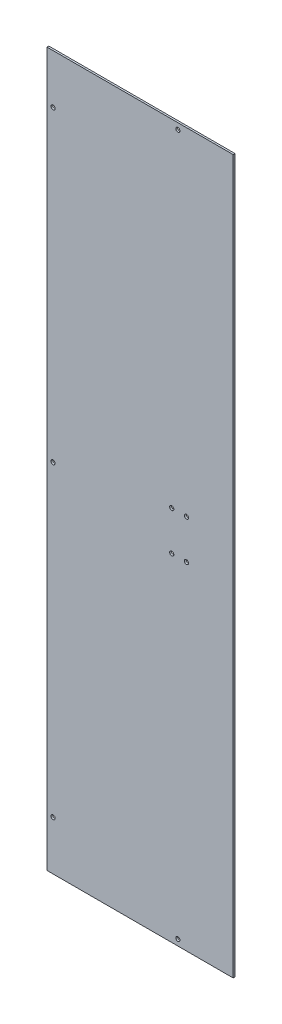
ISO-10303-21;
HEADER;
FILE_DESCRIPTION(('STEP AP214'),'2;1');
FILE_NAME('part.step','',(''),(''),'','','');
FILE_SCHEMA(('AUTOMOTIVE_DESIGN { 1 0 10303 214 1 1 1 1 }'));
ENDSEC;
DATA;
#1=APPLICATION_CONTEXT('core data for automotive mechanical design processes');
#2=APPLICATION_PROTOCOL_DEFINITION('international standard','automotive_design',2000,#1);
#3=PRODUCT_CONTEXT('',#1,'mechanical');
#4=PRODUCT('Part','Part','',(#3));
#5=PRODUCT_RELATED_PRODUCT_CATEGORY('part','',(#4));
#6=PRODUCT_DEFINITION_FORMATION('','',#4);
#7=PRODUCT_DEFINITION_CONTEXT('part definition',#1,'design');
#8=PRODUCT_DEFINITION('design','',#6,#7);
#9=PRODUCT_DEFINITION_SHAPE('','',#8);
#10=(LENGTH_UNIT() NAMED_UNIT(*) SI_UNIT(.MILLI.,.METRE.));
#11=(NAMED_UNIT(*) PLANE_ANGLE_UNIT() SI_UNIT($,.RADIAN.));
#12=(NAMED_UNIT(*) SI_UNIT($,.STERADIAN.) SOLID_ANGLE_UNIT());
#13=UNCERTAINTY_MEASURE_WITH_UNIT(LENGTH_MEASURE(1.E-05),#10,'distance_accuracy_value','');
#14=(GEOMETRIC_REPRESENTATION_CONTEXT(3) GLOBAL_UNCERTAINTY_ASSIGNED_CONTEXT((#13)) GLOBAL_UNIT_ASSIGNED_CONTEXT((#10,
#11,#12)) REPRESENTATION_CONTEXT('',''));
#15=CARTESIAN_POINT('',(0.,0.,0.));
#16=DIRECTION('',(0.,0.,1.));
#17=DIRECTION('',(1.,0.,0.));
#18=AXIS2_PLACEMENT_3D('',#15,#16,#17);
#19=CARTESIAN_POINT('',(83.5,290.,110.));
#20=DIRECTION('',(-1.,0.,0.));
#21=DIRECTION('',(0.,0.,1.));
#22=AXIS2_PLACEMENT_3D('',#19,#20,#21);
#23=PLANE('',#22);
#24=DIRECTION('',(0.,-1.,0.));
#25=VECTOR('',#24,1.);
#26=CARTESIAN_POINT('',(83.5,290.,111.5));
#27=LINE('',#26,#25);
#28=CARTESIAN_POINT('',(83.5,290.,111.5));
#29=VERTEX_POINT('',#28);
#30=CARTESIAN_POINT('',(83.5,-290.,111.5));
#31=VERTEX_POINT('',#30);
#32=EDGE_CURVE('E106',#29,#31,#27,.T.);
#33=ORIENTED_EDGE('',*,*,#32,.F.);
#34=DIRECTION('',(0.,0.,1.));
#35=VECTOR('',#34,1.);
#36=CARTESIAN_POINT('',(83.5,290.,110.));
#37=LINE('',#36,#35);
#38=CARTESIAN_POINT('',(83.5,290.,110.));
#39=VERTEX_POINT('',#38);
#40=EDGE_CURVE('E11',#39,#29,#37,.T.);
#41=ORIENTED_EDGE('',*,*,#40,.F.);
#42=DIRECTION('',(0.,-1.,0.));
#43=VECTOR('',#42,1.);
#44=CARTESIAN_POINT('',(83.5,290.,110.));
#45=LINE('',#44,#43);
#46=CARTESIAN_POINT('',(83.5,-290.,110.));
#47=VERTEX_POINT('',#46);
#48=EDGE_CURVE('E97',#39,#47,#45,.T.);
#49=ORIENTED_EDGE('',*,*,#48,.T.);
#50=DIRECTION('',(0.,0.,1.));
#51=VECTOR('',#50,1.);
#52=CARTESIAN_POINT('',(83.5,-290.,110.));
#53=LINE('',#52,#51);
#54=EDGE_CURVE('E42',#47,#31,#53,.T.);
#55=ORIENTED_EDGE('',*,*,#54,.T.);
#56=EDGE_LOOP('',(#33,#41,#49,#55));
#57=FACE_BOUND('',#56,.T.);
#58=ADVANCED_FACE('F41',(#57),#23,.T.);
#59=CARTESIAN_POINT('',(83.5,290.,110.));
#60=DIRECTION('',(0.,1.,0.));
#61=DIRECTION('',(0.,0.,1.));
#62=AXIS2_PLACEMENT_3D('',#59,#60,#61);
#63=PLANE('',#62);
#64=DIRECTION('',(-1.,0.,0.));
#65=VECTOR('',#64,1.);
#66=CARTESIAN_POINT('',(83.5,290.,111.5));
#67=LINE('',#66,#65);
#68=CARTESIAN_POINT('',(235.,290.,111.5));
#69=VERTEX_POINT('',#68);
#70=EDGE_CURVE('E101',#69,#29,#67,.T.);
#71=ORIENTED_EDGE('',*,*,#70,.F.);
#72=DIRECTION('',(0.,0.,1.));
#73=VECTOR('',#72,1.);
#74=CARTESIAN_POINT('',(235.,290.,110.));
#75=LINE('',#74,#73);
#76=CARTESIAN_POINT('',(235.,290.,110.));
#77=VERTEX_POINT('',#76);
#78=EDGE_CURVE('E49',#77,#69,#75,.T.);
#79=ORIENTED_EDGE('',*,*,#78,.F.);
#80=DIRECTION('',(-1.,0.,0.));
#81=VECTOR('',#80,1.);
#82=CARTESIAN_POINT('',(83.5,290.,110.));
#83=LINE('',#82,#81);
#84=EDGE_CURVE('E96',#77,#39,#83,.T.);
#85=ORIENTED_EDGE('',*,*,#84,.T.);
#86=ORIENTED_EDGE('',*,*,#40,.T.);
#87=EDGE_LOOP('',(#71,#79,#85,#86));
#88=FACE_BOUND('',#87,.T.);
#89=ADVANCED_FACE('F120',(#88),#63,.T.);
#90=CARTESIAN_POINT('',(235.,290.,110.));
#91=DIRECTION('',(1.,0.,0.));
#92=DIRECTION('',(0.,0.,-1.));
#93=AXIS2_PLACEMENT_3D('',#90,#91,#92);
#94=PLANE('',#93);
#95=DIRECTION('',(0.,1.,0.));
#96=VECTOR('',#95,1.);
#97=CARTESIAN_POINT('',(235.,290.,111.5));
#98=LINE('',#97,#96);
#99=CARTESIAN_POINT('',(235.,-290.,111.5));
#100=VERTEX_POINT('',#99);
#101=EDGE_CURVE('E93',#100,#69,#98,.T.);
#102=ORIENTED_EDGE('',*,*,#101,.F.);
#103=DIRECTION('',(0.,0.,1.));
#104=VECTOR('',#103,1.);
#105=CARTESIAN_POINT('',(235.,-290.,110.));
#106=LINE('',#105,#104);
#107=CARTESIAN_POINT('',(235.,-290.,110.));
#108=VERTEX_POINT('',#107);
#109=EDGE_CURVE('E88',#108,#100,#106,.T.);
#110=ORIENTED_EDGE('',*,*,#109,.F.);
#111=DIRECTION('',(0.,1.,0.));
#112=VECTOR('',#111,1.);
#113=CARTESIAN_POINT('',(235.,290.,110.));
#114=LINE('',#113,#112);
#115=EDGE_CURVE('E90',#108,#77,#114,.T.);
#116=ORIENTED_EDGE('',*,*,#115,.T.);
#117=ORIENTED_EDGE('',*,*,#78,.T.);
#118=EDGE_LOOP('',(#102,#110,#116,#117));
#119=FACE_BOUND('',#118,.T.);
#120=ADVANCED_FACE('F86',(#119),#94,.T.);
#121=CARTESIAN_POINT('',(83.5,-290.,110.));
#122=DIRECTION('',(0.,-1.,0.));
#123=DIRECTION('',(0.,0.,-1.));
#124=AXIS2_PLACEMENT_3D('',#121,#122,#123);
#125=PLANE('',#124);
#126=DIRECTION('',(1.,0.,0.));
#127=VECTOR('',#126,1.);
#128=CARTESIAN_POINT('',(83.5,-290.,111.5));
#129=LINE('',#128,#127);
#130=EDGE_CURVE('E108',#31,#100,#129,.T.);
#131=ORIENTED_EDGE('',*,*,#130,.F.);
#132=ORIENTED_EDGE('',*,*,#54,.F.);
#133=DIRECTION('',(1.,0.,0.));
#134=VECTOR('',#133,1.);
#135=CARTESIAN_POINT('',(83.5,-290.,110.));
#136=LINE('',#135,#134);
#137=EDGE_CURVE('E92',#47,#108,#136,.T.);
#138=ORIENTED_EDGE('',*,*,#137,.T.);
#139=ORIENTED_EDGE('',*,*,#109,.T.);
#140=EDGE_LOOP('',(#131,#132,#138,#139));
#141=FACE_BOUND('',#140,.T.);
#142=ADVANCED_FACE('F98',(#141),#125,.T.);
#143=CARTESIAN_POINT('',(0.,0.,110.));
#144=DIRECTION('',(0.,0.,1.));
#145=DIRECTION('',(1.,0.,0.));
#146=AXIS2_PLACEMENT_3D('',#143,#144,#145);
#147=PLANE('',#146);
#148=CARTESIAN_POINT('',(190.,285.,110.));
#149=DIRECTION('',(0.,0.,1.));
#150=DIRECTION('',(1.,0.,0.));
#151=AXIS2_PLACEMENT_3D('',#148,#149,#150);
#152=CIRCLE('',#151,1.70000000000001);
#153=CARTESIAN_POINT('',(191.7,285.,110.));
#154=VERTEX_POINT('',#153);
#155=EDGE_CURVE('E179',#154,#154,#152,.T.);
#156=ORIENTED_EDGE('',*,*,#155,.T.);
#157=EDGE_LOOP('',(#156));
#158=FACE_BOUND('',#157,.T.);
#159=CARTESIAN_POINT('',(197.,16.,110.));
#160=DIRECTION('',(0.,0.,1.));
#161=DIRECTION('',(1.,0.,0.));
#162=AXIS2_PLACEMENT_3D('',#159,#160,#161);
#163=CIRCLE('',#162,1.70000000000001);
#164=CARTESIAN_POINT('',(198.7,16.,110.));
#165=VERTEX_POINT('',#164);
#166=EDGE_CURVE('E187',#165,#165,#163,.T.);
#167=ORIENTED_EDGE('',*,*,#166,.T.);
#168=EDGE_LOOP('',(#167));
#169=FACE_BOUND('',#168,.T.);
#170=CARTESIAN_POINT('',(185.,16.,110.));
#171=DIRECTION('',(0.,0.,1.));
#172=DIRECTION('',(1.,0.,0.));
#173=AXIS2_PLACEMENT_3D('',#170,#171,#172);
#174=CIRCLE('',#173,1.70000000000001);
#175=CARTESIAN_POINT('',(186.7,16.,110.));
#176=VERTEX_POINT('',#175);
#177=EDGE_CURVE('E195',#176,#176,#174,.T.);
#178=ORIENTED_EDGE('',*,*,#177,.T.);
#179=EDGE_LOOP('',(#178));
#180=FACE_BOUND('',#179,.T.);
#181=CARTESIAN_POINT('',(88.5,250.,110.));
#182=DIRECTION('',(0.,0.,1.));
#183=DIRECTION('',(1.,0.,0.));
#184=AXIS2_PLACEMENT_3D('',#181,#182,#183);
#185=CIRCLE('',#184,1.69999999999999);
#186=CARTESIAN_POINT('',(90.2,250.,110.));
#187=VERTEX_POINT('',#186);
#188=EDGE_CURVE('E196',#187,#187,#185,.T.);
#189=ORIENTED_EDGE('',*,*,#188,.T.);
#190=EDGE_LOOP('',(#189));
#191=FACE_BOUND('',#190,.T.);
#192=CARTESIAN_POINT('',(88.5,0.,110.));
#193=DIRECTION('',(0.,0.,1.));
#194=DIRECTION('',(1.,0.,0.));
#195=AXIS2_PLACEMENT_3D('',#192,#193,#194);
#196=CIRCLE('',#195,1.69999999999999);
#197=CARTESIAN_POINT('',(90.2,0.,110.));
#198=VERTEX_POINT('',#197);
#199=EDGE_CURVE('E204',#198,#198,#196,.T.);
#200=ORIENTED_EDGE('',*,*,#199,.T.);
#201=EDGE_LOOP('',(#200));
#202=FACE_BOUND('',#201,.T.);
#203=CARTESIAN_POINT('',(197.,-16.,110.));
#204=DIRECTION('',(0.,0.,1.));
#205=DIRECTION('',(1.,0.,0.));
#206=AXIS2_PLACEMENT_3D('',#203,#204,#205);
#207=CIRCLE('',#206,1.70000000000001);
#208=CARTESIAN_POINT('',(198.7,-16.,110.));
#209=VERTEX_POINT('',#208);
#210=EDGE_CURVE('E209',#209,#209,#207,.T.);
#211=ORIENTED_EDGE('',*,*,#210,.T.);
#212=EDGE_LOOP('',(#211));
#213=FACE_BOUND('',#212,.T.);
#214=CARTESIAN_POINT('',(185.,-16.,110.));
#215=DIRECTION('',(0.,0.,1.));
#216=DIRECTION('',(1.,0.,0.));
#217=AXIS2_PLACEMENT_3D('',#214,#215,#216);
#218=CIRCLE('',#217,1.70000000000001);
#219=CARTESIAN_POINT('',(186.7,-16.,110.));
#220=VERTEX_POINT('',#219);
#221=EDGE_CURVE('E216',#220,#220,#218,.T.);
#222=ORIENTED_EDGE('',*,*,#221,.T.);
#223=EDGE_LOOP('',(#222));
#224=FACE_BOUND('',#223,.T.);
#225=CARTESIAN_POINT('',(190.,-285.,110.));
#226=DIRECTION('',(0.,0.,1.));
#227=DIRECTION('',(1.,0.,0.));
#228=AXIS2_PLACEMENT_3D('',#225,#226,#227);
#229=CIRCLE('',#228,1.70000000000001);
#230=CARTESIAN_POINT('',(191.7,-285.,110.));
#231=VERTEX_POINT('',#230);
#232=EDGE_CURVE('E225',#231,#231,#229,.T.);
#233=ORIENTED_EDGE('',*,*,#232,.T.);
#234=EDGE_LOOP('',(#233));
#235=FACE_BOUND('',#234,.T.);
#236=CARTESIAN_POINT('',(88.5,-250.,110.));
#237=DIRECTION('',(0.,0.,1.));
#238=DIRECTION('',(1.,0.,0.));
#239=AXIS2_PLACEMENT_3D('',#236,#237,#238);
#240=CIRCLE('',#239,1.69999999999999);
#241=CARTESIAN_POINT('',(90.2,-250.,110.));
#242=VERTEX_POINT('',#241);
#243=EDGE_CURVE('E109',#242,#242,#240,.T.);
#244=ORIENTED_EDGE('',*,*,#243,.T.);
#245=EDGE_LOOP('',(#244));
#246=FACE_BOUND('',#245,.T.);
#247=ORIENTED_EDGE('',*,*,#48,.F.);
#248=ORIENTED_EDGE('',*,*,#84,.F.);
#249=ORIENTED_EDGE('',*,*,#115,.F.);
#250=ORIENTED_EDGE('',*,*,#137,.F.);
#251=EDGE_LOOP('',(#247,#248,#249,#250));
#252=FACE_BOUND('',#251,.T.);
#253=ADVANCED_FACE('F94',(#158,#169,#180,#191,#202,#213,#224,#235,#246,#252),#147,.F.);
#254=CARTESIAN_POINT('',(0.,0.,111.5));
#255=DIRECTION('',(0.,0.,1.));
#256=DIRECTION('',(1.,0.,0.));
#257=AXIS2_PLACEMENT_3D('',#254,#255,#256);
#258=PLANE('',#257);
#259=CARTESIAN_POINT('',(190.,285.,111.5));
#260=DIRECTION('',(0.,0.,1.));
#261=DIRECTION('',(1.,0.,0.));
#262=AXIS2_PLACEMENT_3D('',#259,#260,#261);
#263=CIRCLE('',#262,1.70000000000001);
#264=CARTESIAN_POINT('',(191.7,285.,111.5));
#265=VERTEX_POINT('',#264);
#266=EDGE_CURVE('E182',#265,#265,#263,.T.);
#267=ORIENTED_EDGE('',*,*,#266,.F.);
#268=EDGE_LOOP('',(#267));
#269=FACE_BOUND('',#268,.T.);
#270=CARTESIAN_POINT('',(197.,16.,111.5));
#271=DIRECTION('',(0.,0.,1.));
#272=DIRECTION('',(1.,0.,0.));
#273=AXIS2_PLACEMENT_3D('',#270,#271,#272);
#274=CIRCLE('',#273,1.70000000000001);
#275=CARTESIAN_POINT('',(198.7,16.,111.5));
#276=VERTEX_POINT('',#275);
#277=EDGE_CURVE('E181',#276,#276,#274,.T.);
#278=ORIENTED_EDGE('',*,*,#277,.F.);
#279=EDGE_LOOP('',(#278));
#280=FACE_BOUND('',#279,.T.);
#281=CARTESIAN_POINT('',(185.,16.,111.5));
#282=DIRECTION('',(0.,0.,1.));
#283=DIRECTION('',(1.,0.,0.));
#284=AXIS2_PLACEMENT_3D('',#281,#282,#283);
#285=CIRCLE('',#284,1.70000000000001);
#286=CARTESIAN_POINT('',(186.7,16.,111.5));
#287=VERTEX_POINT('',#286);
#288=EDGE_CURVE('E186',#287,#287,#285,.T.);
#289=ORIENTED_EDGE('',*,*,#288,.F.);
#290=EDGE_LOOP('',(#289));
#291=FACE_BOUND('',#290,.T.);
#292=CARTESIAN_POINT('',(88.5,250.,111.5));
#293=DIRECTION('',(0.,0.,1.));
#294=DIRECTION('',(1.,0.,0.));
#295=AXIS2_PLACEMENT_3D('',#292,#293,#294);
#296=CIRCLE('',#295,1.69999999999999);
#297=CARTESIAN_POINT('',(90.2,250.,111.5));
#298=VERTEX_POINT('',#297);
#299=EDGE_CURVE('E193',#298,#298,#296,.T.);
#300=ORIENTED_EDGE('',*,*,#299,.F.);
#301=EDGE_LOOP('',(#300));
#302=FACE_BOUND('',#301,.T.);
#303=CARTESIAN_POINT('',(88.5,0.,111.5));
#304=DIRECTION('',(0.,0.,1.));
#305=DIRECTION('',(1.,0.,0.));
#306=AXIS2_PLACEMENT_3D('',#303,#304,#305);
#307=CIRCLE('',#306,1.69999999999999);
#308=CARTESIAN_POINT('',(90.2,0.,111.5));
#309=VERTEX_POINT('',#308);
#310=EDGE_CURVE('E203',#309,#309,#307,.T.);
#311=ORIENTED_EDGE('',*,*,#310,.F.);
#312=EDGE_LOOP('',(#311));
#313=FACE_BOUND('',#312,.T.);
#314=CARTESIAN_POINT('',(197.,-16.,111.5));
#315=DIRECTION('',(0.,0.,1.));
#316=DIRECTION('',(1.,0.,0.));
#317=AXIS2_PLACEMENT_3D('',#314,#315,#316);
#318=CIRCLE('',#317,1.70000000000001);
#319=CARTESIAN_POINT('',(198.7,-16.,111.5));
#320=VERTEX_POINT('',#319);
#321=EDGE_CURVE('E210',#320,#320,#318,.T.);
#322=ORIENTED_EDGE('',*,*,#321,.F.);
#323=EDGE_LOOP('',(#322));
#324=FACE_BOUND('',#323,.T.);
#325=CARTESIAN_POINT('',(185.,-16.,111.5));
#326=DIRECTION('',(0.,0.,1.));
#327=DIRECTION('',(1.,0.,0.));
#328=AXIS2_PLACEMENT_3D('',#325,#326,#327);
#329=CIRCLE('',#328,1.70000000000001);
#330=CARTESIAN_POINT('',(186.7,-16.,111.5));
#331=VERTEX_POINT('',#330);
#332=EDGE_CURVE('E213',#331,#331,#329,.T.);
#333=ORIENTED_EDGE('',*,*,#332,.F.);
#334=EDGE_LOOP('',(#333));
#335=FACE_BOUND('',#334,.T.);
#336=CARTESIAN_POINT('',(190.,-285.,111.5));
#337=DIRECTION('',(0.,0.,1.));
#338=DIRECTION('',(1.,0.,0.));
#339=AXIS2_PLACEMENT_3D('',#336,#337,#338);
#340=CIRCLE('',#339,1.70000000000001);
#341=CARTESIAN_POINT('',(191.7,-285.,111.5));
#342=VERTEX_POINT('',#341);
#343=EDGE_CURVE('E218',#342,#342,#340,.T.);
#344=ORIENTED_EDGE('',*,*,#343,.F.);
#345=EDGE_LOOP('',(#344));
#346=FACE_BOUND('',#345,.T.);
#347=CARTESIAN_POINT('',(88.5,-250.,111.5));
#348=DIRECTION('',(0.,0.,1.));
#349=DIRECTION('',(1.,0.,0.));
#350=AXIS2_PLACEMENT_3D('',#347,#348,#349);
#351=CIRCLE('',#350,1.69999999999999);
#352=CARTESIAN_POINT('',(90.2,-250.,111.5));
#353=VERTEX_POINT('',#352);
#354=EDGE_CURVE('E223',#353,#353,#351,.T.);
#355=ORIENTED_EDGE('',*,*,#354,.F.);
#356=EDGE_LOOP('',(#355));
#357=FACE_BOUND('',#356,.T.);
#358=ORIENTED_EDGE('',*,*,#32,.T.);
#359=ORIENTED_EDGE('',*,*,#130,.T.);
#360=ORIENTED_EDGE('',*,*,#101,.T.);
#361=ORIENTED_EDGE('',*,*,#70,.T.);
#362=EDGE_LOOP('',(#358,#359,#360,#361));
#363=FACE_BOUND('',#362,.T.);
#364=ADVANCED_FACE('F117',(#269,#280,#291,#302,#313,#324,#335,#346,#357,#363),#258,.T.);
#365=CARTESIAN_POINT('',(88.5,-250.,110.));
#366=DIRECTION('',(0.,0.,1.));
#367=DIRECTION('',(1.,0.,0.));
#368=AXIS2_PLACEMENT_3D('',#365,#366,#367);
#369=CYLINDRICAL_SURFACE('',#368,1.69999999999999);
#370=ORIENTED_EDGE('',*,*,#243,.F.);
#371=EDGE_LOOP('',(#370));
#372=FACE_BOUND('',#371,.T.);
#373=ORIENTED_EDGE('',*,*,#354,.T.);
#374=EDGE_LOOP('',(#373));
#375=FACE_BOUND('',#374,.T.);
#376=ADVANCED_FACE('F133',(#372,#375),#369,.F.);
#377=CARTESIAN_POINT('',(190.,-285.,110.));
#378=DIRECTION('',(0.,0.,1.));
#379=DIRECTION('',(1.,0.,0.));
#380=AXIS2_PLACEMENT_3D('',#377,#378,#379);
#381=CYLINDRICAL_SURFACE('',#380,1.70000000000001);
#382=ORIENTED_EDGE('',*,*,#232,.F.);
#383=EDGE_LOOP('',(#382));
#384=FACE_BOUND('',#383,.T.);
#385=ORIENTED_EDGE('',*,*,#343,.T.);
#386=EDGE_LOOP('',(#385));
#387=FACE_BOUND('',#386,.T.);
#388=ADVANCED_FACE('F142',(#384,#387),#381,.F.);
#389=CARTESIAN_POINT('',(185.,-16.,110.));
#390=DIRECTION('',(0.,0.,1.));
#391=DIRECTION('',(1.,0.,0.));
#392=AXIS2_PLACEMENT_3D('',#389,#390,#391);
#393=CYLINDRICAL_SURFACE('',#392,1.70000000000001);
#394=ORIENTED_EDGE('',*,*,#221,.F.);
#395=EDGE_LOOP('',(#394));
#396=FACE_BOUND('',#395,.T.);
#397=ORIENTED_EDGE('',*,*,#332,.T.);
#398=EDGE_LOOP('',(#397));
#399=FACE_BOUND('',#398,.T.);
#400=ADVANCED_FACE('F148',(#396,#399),#393,.F.);
#401=CARTESIAN_POINT('',(197.,-16.,110.));
#402=DIRECTION('',(0.,0.,1.));
#403=DIRECTION('',(1.,0.,0.));
#404=AXIS2_PLACEMENT_3D('',#401,#402,#403);
#405=CYLINDRICAL_SURFACE('',#404,1.70000000000001);
#406=ORIENTED_EDGE('',*,*,#210,.F.);
#407=EDGE_LOOP('',(#406));
#408=FACE_BOUND('',#407,.T.);
#409=ORIENTED_EDGE('',*,*,#321,.T.);
#410=EDGE_LOOP('',(#409));
#411=FACE_BOUND('',#410,.T.);
#412=ADVANCED_FACE('F147',(#408,#411),#405,.F.);
#413=CARTESIAN_POINT('',(88.5,0.,110.));
#414=DIRECTION('',(0.,0.,1.));
#415=DIRECTION('',(1.,0.,0.));
#416=AXIS2_PLACEMENT_3D('',#413,#414,#415);
#417=CYLINDRICAL_SURFACE('',#416,1.69999999999999);
#418=ORIENTED_EDGE('',*,*,#199,.F.);
#419=EDGE_LOOP('',(#418));
#420=FACE_BOUND('',#419,.T.);
#421=ORIENTED_EDGE('',*,*,#310,.T.);
#422=EDGE_LOOP('',(#421));
#423=FACE_BOUND('',#422,.T.);
#424=ADVANCED_FACE('F152',(#420,#423),#417,.F.);
#425=CARTESIAN_POINT('',(88.5,250.,110.));
#426=DIRECTION('',(0.,0.,1.));
#427=DIRECTION('',(1.,0.,0.));
#428=AXIS2_PLACEMENT_3D('',#425,#426,#427);
#429=CYLINDRICAL_SURFACE('',#428,1.69999999999999);
#430=ORIENTED_EDGE('',*,*,#188,.F.);
#431=EDGE_LOOP('',(#430));
#432=FACE_BOUND('',#431,.T.);
#433=ORIENTED_EDGE('',*,*,#299,.T.);
#434=EDGE_LOOP('',(#433));
#435=FACE_BOUND('',#434,.T.);
#436=ADVANCED_FACE('F158',(#432,#435),#429,.F.);
#437=CARTESIAN_POINT('',(185.,16.,110.));
#438=DIRECTION('',(0.,0.,1.));
#439=DIRECTION('',(1.,0.,0.));
#440=AXIS2_PLACEMENT_3D('',#437,#438,#439);
#441=CYLINDRICAL_SURFACE('',#440,1.70000000000001);
#442=ORIENTED_EDGE('',*,*,#177,.F.);
#443=EDGE_LOOP('',(#442));
#444=FACE_BOUND('',#443,.T.);
#445=ORIENTED_EDGE('',*,*,#288,.T.);
#446=EDGE_LOOP('',(#445));
#447=FACE_BOUND('',#446,.T.);
#448=ADVANCED_FACE('F165',(#444,#447),#441,.F.);
#449=CARTESIAN_POINT('',(197.,16.,110.));
#450=DIRECTION('',(0.,0.,1.));
#451=DIRECTION('',(1.,0.,0.));
#452=AXIS2_PLACEMENT_3D('',#449,#450,#451);
#453=CYLINDRICAL_SURFACE('',#452,1.70000000000001);
#454=ORIENTED_EDGE('',*,*,#166,.F.);
#455=EDGE_LOOP('',(#454));
#456=FACE_BOUND('',#455,.T.);
#457=ORIENTED_EDGE('',*,*,#277,.T.);
#458=EDGE_LOOP('',(#457));
#459=FACE_BOUND('',#458,.T.);
#460=ADVANCED_FACE('F167',(#456,#459),#453,.F.);
#461=CARTESIAN_POINT('',(190.,285.,110.));
#462=DIRECTION('',(0.,0.,1.));
#463=DIRECTION('',(1.,0.,0.));
#464=AXIS2_PLACEMENT_3D('',#461,#462,#463);
#465=CYLINDRICAL_SURFACE('',#464,1.70000000000001);
#466=ORIENTED_EDGE('',*,*,#155,.F.);
#467=EDGE_LOOP('',(#466));
#468=FACE_BOUND('',#467,.T.);
#469=ORIENTED_EDGE('',*,*,#266,.T.);
#470=EDGE_LOOP('',(#469));
#471=FACE_BOUND('',#470,.T.);
#472=ADVANCED_FACE('F168',(#468,#471),#465,.F.);
#473=CLOSED_SHELL('',(#58,#89,#120,#142,#253,#364,#376,#388,#400,#412,#424,#436,#448,#460,#472));
#474=MANIFOLD_SOLID_BREP('B2',#473);
#475=ADVANCED_BREP_SHAPE_REPRESENTATION('',(#18,#474),#14);
#476=SHAPE_DEFINITION_REPRESENTATION(#9,#475);
ENDSEC;
END-ISO-10303-21;
